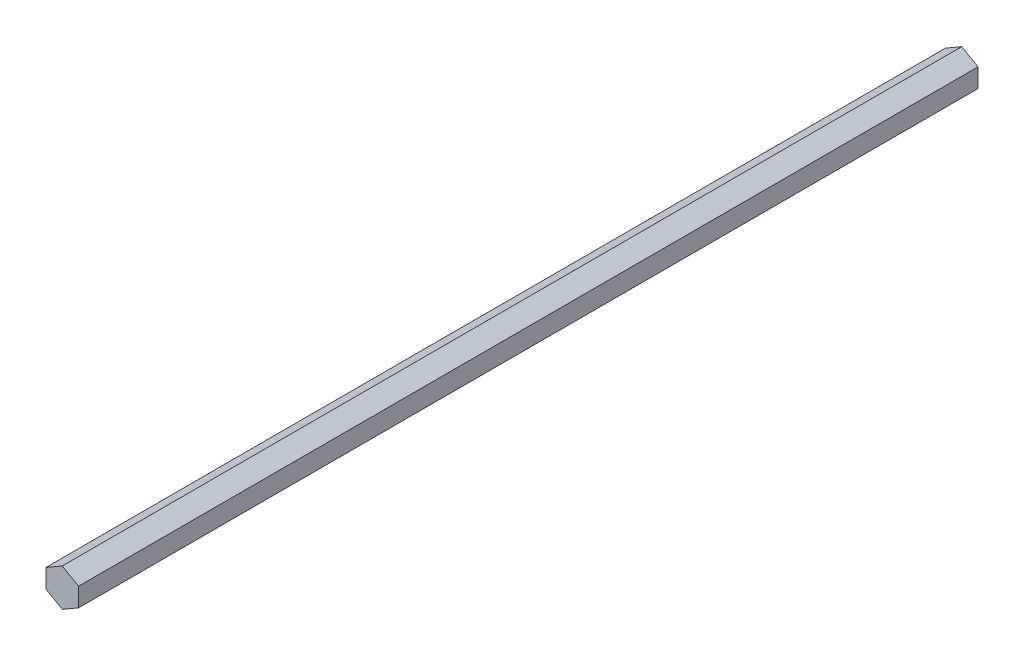
ISO-10303-21;
HEADER;
FILE_DESCRIPTION(('STEP AP214'),'2;1');
FILE_NAME('part.step','',(''),(''),'','','');
FILE_SCHEMA(('AUTOMOTIVE_DESIGN { 1 0 10303 214 1 1 1 1 }'));
ENDSEC;
DATA;
#1=APPLICATION_CONTEXT('core data for automotive mechanical design processes');
#2=APPLICATION_PROTOCOL_DEFINITION('international standard','automotive_design',2000,#1);
#3=PRODUCT_CONTEXT('',#1,'mechanical');
#4=PRODUCT('Part','Part','',(#3));
#5=PRODUCT_RELATED_PRODUCT_CATEGORY('part','',(#4));
#6=PRODUCT_DEFINITION_FORMATION('','',#4);
#7=PRODUCT_DEFINITION_CONTEXT('part definition',#1,'design');
#8=PRODUCT_DEFINITION('design','',#6,#7);
#9=PRODUCT_DEFINITION_SHAPE('','',#8);
#10=(LENGTH_UNIT() NAMED_UNIT(*) SI_UNIT(.MILLI.,.METRE.));
#11=(NAMED_UNIT(*) PLANE_ANGLE_UNIT() SI_UNIT($,.RADIAN.));
#12=(NAMED_UNIT(*) SI_UNIT($,.STERADIAN.) SOLID_ANGLE_UNIT());
#13=UNCERTAINTY_MEASURE_WITH_UNIT(LENGTH_MEASURE(1.E-05),#10,'distance_accuracy_value','');
#14=(GEOMETRIC_REPRESENTATION_CONTEXT(3) GLOBAL_UNCERTAINTY_ASSIGNED_CONTEXT((#13)) GLOBAL_UNIT_ASSIGNED_CONTEXT((#10,
#11,#12)) REPRESENTATION_CONTEXT('',''));
#15=CARTESIAN_POINT('',(0.,0.,0.));
#16=DIRECTION('',(0.,0.,1.));
#17=DIRECTION('',(1.,0.,0.));
#18=AXIS2_PLACEMENT_3D('',#15,#16,#17);
#19=CARTESIAN_POINT('',(-6.35,3.66617420935411,152.4));
#20=DIRECTION('',(1.,0.,0.));
#21=DIRECTION('',(0.,0.,-1.));
#22=AXIS2_PLACEMENT_3D('',#19,#20,#21);
#23=PLANE('',#22);
#24=DIRECTION('',(0.,0.,-1.));
#25=VECTOR('',#24,1.);
#26=CARTESIAN_POINT('',(-6.35,3.66617420935411,152.4));
#27=LINE('',#26,#25);
#28=CARTESIAN_POINT('',(-6.35,3.66617420935411,198.628));
#29=VERTEX_POINT('',#28);
#30=CARTESIAN_POINT('',(-6.35,3.66617420935411,-152.4));
#31=VERTEX_POINT('',#30);
#32=EDGE_CURVE('E58',#29,#31,#27,.T.);
#33=ORIENTED_EDGE('',*,*,#32,.T.);
#34=DIRECTION('',(0.,-1.,0.));
#35=VECTOR('',#34,1.);
#36=CARTESIAN_POINT('',(-6.35,3.66617420935411,-152.4));
#37=LINE('',#36,#35);
#38=CARTESIAN_POINT('',(-6.35,-3.66617420935413,-152.4));
#39=VERTEX_POINT('',#38);
#40=EDGE_CURVE('E128',#31,#39,#37,.T.);
#41=ORIENTED_EDGE('',*,*,#40,.T.);
#42=DIRECTION('',(0.,0.,-1.));
#43=VECTOR('',#42,1.);
#44=CARTESIAN_POINT('',(-6.35,-3.66617420935413,152.4));
#45=LINE('',#44,#43);
#46=CARTESIAN_POINT('',(-6.35,-3.66617420935413,198.628));
#47=VERTEX_POINT('',#46);
#48=EDGE_CURVE('E11',#47,#39,#45,.T.);
#49=ORIENTED_EDGE('',*,*,#48,.F.);
#50=DIRECTION('',(0.,-1.,0.));
#51=VECTOR('',#50,1.);
#52=CARTESIAN_POINT('',(-6.35,3.66617420935411,198.628));
#53=LINE('',#52,#51);
#54=EDGE_CURVE('E102',#29,#47,#53,.T.);
#55=ORIENTED_EDGE('',*,*,#54,.F.);
#56=EDGE_LOOP('',(#33,#41,#49,#55));
#57=FACE_BOUND('',#56,.T.);
#58=ADVANCED_FACE('F43',(#57),#23,.F.);
#59=CARTESIAN_POINT('',(-6.35,-3.66617420935413,152.4));
#60=DIRECTION('',(0.5,0.866025403784439,0.));
#61=DIRECTION('',(-0.866025403784439,0.5,0.));
#62=AXIS2_PLACEMENT_3D('',#59,#60,#61);
#63=PLANE('',#62);
#64=ORIENTED_EDGE('',*,*,#48,.T.);
#65=DIRECTION('',(0.866025403784439,-0.5,0.));
#66=VECTOR('',#65,1.);
#67=CARTESIAN_POINT('',(-6.35,-3.66617420935413,-152.4));
#68=LINE('',#67,#66);
#69=CARTESIAN_POINT('',(0.,-7.33234841870826,-152.4));
#70=VERTEX_POINT('',#69);
#71=EDGE_CURVE('E131',#39,#70,#68,.T.);
#72=ORIENTED_EDGE('',*,*,#71,.T.);
#73=DIRECTION('',(0.,0.,-1.));
#74=VECTOR('',#73,1.);
#75=CARTESIAN_POINT('',(0.,-7.33234841870826,152.4));
#76=LINE('',#75,#74);
#77=CARTESIAN_POINT('',(0.,-7.33234841870826,198.628));
#78=VERTEX_POINT('',#77);
#79=EDGE_CURVE('E51',#78,#70,#76,.T.);
#80=ORIENTED_EDGE('',*,*,#79,.F.);
#81=DIRECTION('',(0.866025403784439,-0.5,0.));
#82=VECTOR('',#81,1.);
#83=CARTESIAN_POINT('',(-6.35,-3.66617420935413,198.628));
#84=LINE('',#83,#82);
#85=EDGE_CURVE('E107',#47,#78,#84,.T.);
#86=ORIENTED_EDGE('',*,*,#85,.F.);
#87=EDGE_LOOP('',(#64,#72,#80,#86));
#88=FACE_BOUND('',#87,.T.);
#89=ADVANCED_FACE('F166',(#88),#63,.F.);
#90=CARTESIAN_POINT('',(0.,-7.33234841870826,152.4));
#91=DIRECTION('',(-0.5,0.866025403784439,0.));
#92=DIRECTION('',(-0.866025403784439,-0.5,0.));
#93=AXIS2_PLACEMENT_3D('',#90,#91,#92);
#94=PLANE('',#93);
#95=ORIENTED_EDGE('',*,*,#79,.T.);
#96=DIRECTION('',(0.866025403784439,0.5,0.));
#97=VECTOR('',#96,1.);
#98=CARTESIAN_POINT('',(0.,-7.33234841870826,-152.4));
#99=LINE('',#98,#97);
#100=CARTESIAN_POINT('',(6.35,-3.66617420935414,-152.4));
#101=VERTEX_POINT('',#100);
#102=EDGE_CURVE('E135',#70,#101,#99,.T.);
#103=ORIENTED_EDGE('',*,*,#102,.T.);
#104=DIRECTION('',(0.,0.,-1.));
#105=VECTOR('',#104,1.);
#106=CARTESIAN_POINT('',(6.35,-3.66617420935414,152.4));
#107=LINE('',#106,#105);
#108=CARTESIAN_POINT('',(6.35,-3.66617420935414,198.628));
#109=VERTEX_POINT('',#108);
#110=EDGE_CURVE('E153',#109,#101,#107,.T.);
#111=ORIENTED_EDGE('',*,*,#110,.F.);
#112=DIRECTION('',(0.866025403784439,0.5,0.));
#113=VECTOR('',#112,1.);
#114=CARTESIAN_POINT('',(0.,-7.33234841870826,198.628));
#115=LINE('',#114,#113);
#116=EDGE_CURVE('E119',#78,#109,#115,.T.);
#117=ORIENTED_EDGE('',*,*,#116,.F.);
#118=EDGE_LOOP('',(#95,#103,#111,#117));
#119=FACE_BOUND('',#118,.T.);
#120=ADVANCED_FACE('F159',(#119),#94,.F.);
#121=CARTESIAN_POINT('',(6.35,-3.66617420935414,152.4));
#122=DIRECTION('',(-1.,0.,0.));
#123=DIRECTION('',(0.,-1.,0.));
#124=AXIS2_PLACEMENT_3D('',#121,#122,#123);
#125=PLANE('',#124);
#126=ORIENTED_EDGE('',*,*,#110,.T.);
#127=DIRECTION('',(0.,1.,0.));
#128=VECTOR('',#127,1.);
#129=CARTESIAN_POINT('',(6.35,-3.66617420935414,-152.4));
#130=LINE('',#129,#128);
#131=CARTESIAN_POINT('',(6.35,3.66617420935412,-152.4));
#132=VERTEX_POINT('',#131);
#133=EDGE_CURVE('E139',#101,#132,#130,.T.);
#134=ORIENTED_EDGE('',*,*,#133,.T.);
#135=DIRECTION('',(0.,0.,-1.));
#136=VECTOR('',#135,1.);
#137=CARTESIAN_POINT('',(6.35,3.66617420935412,152.4));
#138=LINE('',#137,#136);
#139=CARTESIAN_POINT('',(6.35,3.66617420935412,198.628));
#140=VERTEX_POINT('',#139);
#141=EDGE_CURVE('E150',#140,#132,#138,.T.);
#142=ORIENTED_EDGE('',*,*,#141,.F.);
#143=DIRECTION('',(0.,1.,0.));
#144=VECTOR('',#143,1.);
#145=CARTESIAN_POINT('',(6.35,-3.66617420935414,198.628));
#146=LINE('',#145,#144);
#147=EDGE_CURVE('E123',#109,#140,#146,.T.);
#148=ORIENTED_EDGE('',*,*,#147,.F.);
#149=EDGE_LOOP('',(#126,#134,#142,#148));
#150=FACE_BOUND('',#149,.T.);
#151=ADVANCED_FACE('F169',(#150),#125,.F.);
#152=CARTESIAN_POINT('',(6.35,3.66617420935412,152.4));
#153=DIRECTION('',(-0.5,-0.866025403784439,0.));
#154=DIRECTION('',(0.866025403784439,-0.5,0.));
#155=AXIS2_PLACEMENT_3D('',#152,#153,#154);
#156=PLANE('',#155);
#157=ORIENTED_EDGE('',*,*,#141,.T.);
#158=DIRECTION('',(-0.866025403784439,0.5,0.));
#159=VECTOR('',#158,1.);
#160=CARTESIAN_POINT('',(6.35,3.66617420935412,-152.4));
#161=LINE('',#160,#159);
#162=CARTESIAN_POINT('',(0.,7.33234841870824,-152.4));
#163=VERTEX_POINT('',#162);
#164=EDGE_CURVE('E143',#132,#163,#161,.T.);
#165=ORIENTED_EDGE('',*,*,#164,.T.);
#166=DIRECTION('',(0.,0.,-1.));
#167=VECTOR('',#166,1.);
#168=CARTESIAN_POINT('',(0.,7.33234841870824,152.4));
#169=LINE('',#168,#167);
#170=CARTESIAN_POINT('',(0.,7.33234841870824,198.628));
#171=VERTEX_POINT('',#170);
#172=EDGE_CURVE('E66',#171,#163,#169,.T.);
#173=ORIENTED_EDGE('',*,*,#172,.F.);
#174=DIRECTION('',(-0.866025403784439,0.5,0.));
#175=VECTOR('',#174,1.);
#176=CARTESIAN_POINT('',(6.35,3.66617420935412,198.628));
#177=LINE('',#176,#175);
#178=EDGE_CURVE('E113',#140,#171,#177,.T.);
#179=ORIENTED_EDGE('',*,*,#178,.F.);
#180=EDGE_LOOP('',(#157,#165,#173,#179));
#181=FACE_BOUND('',#180,.T.);
#182=ADVANCED_FACE('F171',(#181),#156,.F.);
#183=CARTESIAN_POINT('',(0.,7.33234841870824,152.4));
#184=DIRECTION('',(0.5,-0.866025403784439,0.));
#185=DIRECTION('',(0.866025403784439,0.5,0.));
#186=AXIS2_PLACEMENT_3D('',#183,#184,#185);
#187=PLANE('',#186);
#188=ORIENTED_EDGE('',*,*,#172,.T.);
#189=DIRECTION('',(-0.866025403784439,-0.5,0.));
#190=VECTOR('',#189,1.);
#191=CARTESIAN_POINT('',(0.,7.33234841870824,-152.4));
#192=LINE('',#191,#190);
#193=EDGE_CURVE('E98',#163,#31,#192,.T.);
#194=ORIENTED_EDGE('',*,*,#193,.T.);
#195=ORIENTED_EDGE('',*,*,#32,.F.);
#196=DIRECTION('',(-0.866025403784439,-0.5,0.));
#197=VECTOR('',#196,1.);
#198=CARTESIAN_POINT('',(0.,7.33234841870824,198.628));
#199=LINE('',#198,#197);
#200=EDGE_CURVE('E96',#171,#29,#199,.T.);
#201=ORIENTED_EDGE('',*,*,#200,.F.);
#202=EDGE_LOOP('',(#188,#194,#195,#201));
#203=FACE_BOUND('',#202,.T.);
#204=ADVANCED_FACE('F94',(#203),#187,.F.);
#205=CARTESIAN_POINT('',(0.,0.,-152.4));
#206=DIRECTION('',(0.,0.,1.));
#207=DIRECTION('',(1.,0.,0.));
#208=AXIS2_PLACEMENT_3D('',#205,#206,#207);
#209=PLANE('',#208);
#210=ORIENTED_EDGE('',*,*,#40,.F.);
#211=ORIENTED_EDGE('',*,*,#193,.F.);
#212=ORIENTED_EDGE('',*,*,#164,.F.);
#213=ORIENTED_EDGE('',*,*,#133,.F.);
#214=ORIENTED_EDGE('',*,*,#102,.F.);
#215=ORIENTED_EDGE('',*,*,#71,.F.);
#216=EDGE_LOOP('',(#210,#211,#212,#213,#214,#215));
#217=FACE_BOUND('',#216,.T.);
#218=ADVANCED_FACE('F164',(#217),#209,.F.);
#219=CARTESIAN_POINT('',(0.,0.,198.628));
#220=DIRECTION('',(0.,0.,1.));
#221=DIRECTION('',(1.,0.,0.));
#222=AXIS2_PLACEMENT_3D('',#219,#220,#221);
#223=PLANE('',#222);
#224=ORIENTED_EDGE('',*,*,#200,.T.);
#225=ORIENTED_EDGE('',*,*,#54,.T.);
#226=ORIENTED_EDGE('',*,*,#85,.T.);
#227=ORIENTED_EDGE('',*,*,#116,.T.);
#228=ORIENTED_EDGE('',*,*,#147,.T.);
#229=ORIENTED_EDGE('',*,*,#178,.T.);
#230=EDGE_LOOP('',(#224,#225,#226,#227,#228,#229));
#231=FACE_BOUND('',#230,.T.);
#232=ADVANCED_FACE('F110',(#231),#223,.T.);
#233=CLOSED_SHELL('',(#58,#89,#120,#151,#182,#204,#218,#232));
#234=MANIFOLD_SOLID_BREP('B2',#233);
#235=ADVANCED_BREP_SHAPE_REPRESENTATION('',(#18,#234),#14);
#236=SHAPE_DEFINITION_REPRESENTATION(#9,#235);
ENDSEC;
END-ISO-10303-21;
